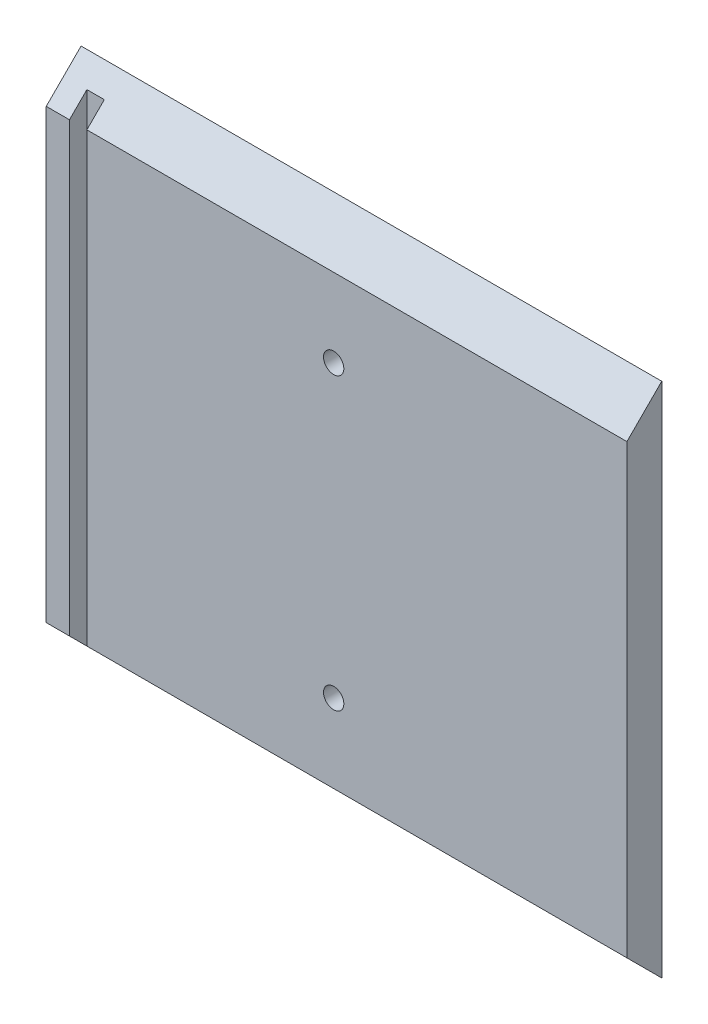
ISO-10303-21;
HEADER;
FILE_DESCRIPTION(('STEP AP214'),'2;1');
FILE_NAME('part.step','',(''),(''),'','','');
FILE_SCHEMA(('AUTOMOTIVE_DESIGN { 1 0 10303 214 1 1 1 1 }'));
ENDSEC;
DATA;
#1=APPLICATION_CONTEXT('core data for automotive mechanical design processes');
#2=APPLICATION_PROTOCOL_DEFINITION('international standard','automotive_design',2000,#1);
#3=PRODUCT_CONTEXT('',#1,'mechanical');
#4=PRODUCT('Part','Part','',(#3));
#5=PRODUCT_RELATED_PRODUCT_CATEGORY('part','',(#4));
#6=PRODUCT_DEFINITION_FORMATION('','',#4);
#7=PRODUCT_DEFINITION_CONTEXT('part definition',#1,'design');
#8=PRODUCT_DEFINITION('design','',#6,#7);
#9=PRODUCT_DEFINITION_SHAPE('','',#8);
#10=(LENGTH_UNIT() NAMED_UNIT(*) SI_UNIT(.MILLI.,.METRE.));
#11=(NAMED_UNIT(*) PLANE_ANGLE_UNIT() SI_UNIT($,.RADIAN.));
#12=(NAMED_UNIT(*) SI_UNIT($,.STERADIAN.) SOLID_ANGLE_UNIT());
#13=UNCERTAINTY_MEASURE_WITH_UNIT(LENGTH_MEASURE(1.E-05),#10,'distance_accuracy_value','');
#14=(GEOMETRIC_REPRESENTATION_CONTEXT(3) GLOBAL_UNCERTAINTY_ASSIGNED_CONTEXT((#13)) GLOBAL_UNIT_ASSIGNED_CONTEXT((#10,
#11,#12)) REPRESENTATION_CONTEXT('',''));
#15=CARTESIAN_POINT('',(0.,0.,0.));
#16=DIRECTION('',(0.,0.,1.));
#17=DIRECTION('',(1.,0.,0.));
#18=AXIS2_PLACEMENT_3D('',#15,#16,#17);
#19=CARTESIAN_POINT('',(0.,0.,6.));
#20=DIRECTION('',(0.,0.,-1.));
#21=DIRECTION('',(-1.,0.,0.));
#22=AXIS2_PLACEMENT_3D('',#19,#20,#21);
#23=PLANE('',#22);
#24=CARTESIAN_POINT('',(-0.499999999999987,-25.,6.));
#25=DIRECTION('',(0.,0.,-1.));
#26=DIRECTION('',(-1.,0.,0.));
#27=AXIS2_PLACEMENT_3D('',#24,#25,#26);
#28=CIRCLE('',#27,1.75);
#29=CARTESIAN_POINT('',(-2.24999999999999,-25.,6.));
#30=VERTEX_POINT('',#29);
#31=EDGE_CURVE('E195',#30,#30,#28,.T.);
#32=ORIENTED_EDGE('',*,*,#31,.T.);
#33=EDGE_LOOP('',(#32));
#34=FACE_BOUND('',#33,.T.);
#35=CARTESIAN_POINT('',(-0.499999999999987,25.,6.));
#36=DIRECTION('',(0.,0.,-1.));
#37=DIRECTION('',(-1.,0.,0.));
#38=AXIS2_PLACEMENT_3D('',#35,#36,#37);
#39=CIRCLE('',#38,1.75);
#40=CARTESIAN_POINT('',(-2.24999999999999,25.,6.));
#41=VERTEX_POINT('',#40);
#42=EDGE_CURVE('E124',#41,#41,#39,.T.);
#43=ORIENTED_EDGE('',*,*,#42,.T.);
#44=EDGE_LOOP('',(#43));
#45=FACE_BOUND('',#44,.T.);
#46=DIRECTION('',(-1.,0.,0.));
#47=VECTOR('',#46,1.);
#48=CARTESIAN_POINT('',(0.,38.5,6.));
#49=LINE('',#48,#47);
#50=CARTESIAN_POINT('',(50.,38.5,6.));
#51=VERTEX_POINT('',#50);
#52=CARTESIAN_POINT('',(-43.,38.5,6.));
#53=VERTEX_POINT('',#52);
#54=EDGE_CURVE('E122',#51,#53,#49,.T.);
#55=ORIENTED_EDGE('',*,*,#54,.T.);
#56=DIRECTION('',(0.,1.,0.));
#57=VECTOR('',#56,1.);
#58=CARTESIAN_POINT('',(-43.,-44.5,6.));
#59=LINE('',#58,#57);
#60=CARTESIAN_POINT('',(-43.,-38.5,6.));
#61=VERTEX_POINT('',#60);
#62=EDGE_CURVE('E108',#61,#53,#59,.T.);
#63=ORIENTED_EDGE('',*,*,#62,.F.);
#64=DIRECTION('',(1.,0.,0.));
#65=VECTOR('',#64,1.);
#66=CARTESIAN_POINT('',(0.,-38.5,6.));
#67=LINE('',#66,#65);
#68=CARTESIAN_POINT('',(50.,-38.5,6.));
#69=VERTEX_POINT('',#68);
#70=EDGE_CURVE('E119',#61,#69,#67,.T.);
#71=ORIENTED_EDGE('',*,*,#70,.T.);
#72=DIRECTION('',(0.,1.,0.));
#73=VECTOR('',#72,1.);
#74=CARTESIAN_POINT('',(50.,-44.5,6.));
#75=LINE('',#74,#73);
#76=EDGE_CURVE('E165',#69,#51,#75,.T.);
#77=ORIENTED_EDGE('',*,*,#76,.T.);
#78=EDGE_LOOP('',(#55,#63,#71,#77));
#79=FACE_BOUND('',#78,.T.);
#80=ADVANCED_FACE('F39',(#34,#45,#79),#23,.F.);
#81=CARTESIAN_POINT('',(50.,-44.5,6.));
#82=DIRECTION('',(-1.,0.,0.));
#83=DIRECTION('',(0.,0.,1.));
#84=AXIS2_PLACEMENT_3D('',#81,#82,#83);
#85=PLANE('',#84);
#86=ORIENTED_EDGE('',*,*,#76,.F.);
#87=DIRECTION('',(0.,0.707106781186547,0.707106781186548));
#88=VECTOR('',#87,1.);
#89=CARTESIAN_POINT('',(50.,-38.5,6.));
#90=LINE('',#89,#88);
#91=CARTESIAN_POINT('',(50.,-44.5,0.));
#92=VERTEX_POINT('',#91);
#93=EDGE_CURVE('E128',#69,#92,#90,.F.);
#94=ORIENTED_EDGE('',*,*,#93,.T.);
#95=DIRECTION('',(0.,1.,0.));
#96=VECTOR('',#95,1.);
#97=CARTESIAN_POINT('',(50.,-44.5,0.));
#98=LINE('',#97,#96);
#99=CARTESIAN_POINT('',(50.,44.5,0.));
#100=VERTEX_POINT('',#99);
#101=EDGE_CURVE('E113',#92,#100,#98,.T.);
#102=ORIENTED_EDGE('',*,*,#101,.T.);
#103=DIRECTION('',(0.,0.707106781186547,-0.707106781186548));
#104=VECTOR('',#103,1.);
#105=CARTESIAN_POINT('',(50.,38.5,6.));
#106=LINE('',#105,#104);
#107=EDGE_CURVE('E136',#100,#51,#106,.F.);
#108=ORIENTED_EDGE('',*,*,#107,.T.);
#109=EDGE_LOOP('',(#86,#94,#102,#108));
#110=FACE_BOUND('',#109,.T.);
#111=ADVANCED_FACE('F184',(#110),#85,.F.);
#112=CARTESIAN_POINT('',(-50.,-44.5,6.));
#113=DIRECTION('',(1.,0.,0.));
#114=DIRECTION('',(0.,0.,-1.));
#115=AXIS2_PLACEMENT_3D('',#112,#113,#114);
#116=PLANE('',#115);
#117=DIRECTION('',(0.,-1.,0.));
#118=VECTOR('',#117,1.);
#119=CARTESIAN_POINT('',(-50.,-44.5,0.));
#120=LINE('',#119,#118);
#121=CARTESIAN_POINT('',(-50.,44.5,0.));
#122=VERTEX_POINT('',#121);
#123=CARTESIAN_POINT('',(-50.,-44.5,0.));
#124=VERTEX_POINT('',#123);
#125=EDGE_CURVE('E176',#122,#124,#120,.T.);
#126=ORIENTED_EDGE('',*,*,#125,.T.);
#127=DIRECTION('',(0.,-0.707106781186547,-0.707106781186548));
#128=VECTOR('',#127,1.);
#129=CARTESIAN_POINT('',(-50.,-38.5,6.));
#130=LINE('',#129,#128);
#131=CARTESIAN_POINT('',(-50.,-38.5,6.));
#132=VERTEX_POINT('',#131);
#133=EDGE_CURVE('E61',#124,#132,#130,.F.);
#134=ORIENTED_EDGE('',*,*,#133,.T.);
#135=DIRECTION('',(0.,-1.,0.));
#136=VECTOR('',#135,1.);
#137=CARTESIAN_POINT('',(-50.,-44.5,6.));
#138=LINE('',#137,#136);
#139=CARTESIAN_POINT('',(-50.,38.5,6.));
#140=VERTEX_POINT('',#139);
#141=EDGE_CURVE('E164',#140,#132,#138,.T.);
#142=ORIENTED_EDGE('',*,*,#141,.F.);
#143=DIRECTION('',(0.,-0.707106781186547,0.707106781186548));
#144=VECTOR('',#143,1.);
#145=CARTESIAN_POINT('',(-50.,38.5,6.));
#146=LINE('',#145,#144);
#147=EDGE_CURVE('E143',#140,#122,#146,.F.);
#148=ORIENTED_EDGE('',*,*,#147,.T.);
#149=EDGE_LOOP('',(#126,#134,#142,#148));
#150=FACE_BOUND('',#149,.T.);
#151=ADVANCED_FACE('F231',(#150),#116,.F.);
#152=CARTESIAN_POINT('',(-46.,-38.5,6.));
#153=VERTEX_POINT('',#152);
#154=EDGE_CURVE('E131',#132,#153,#67,.T.);
#155=ORIENTED_EDGE('',*,*,#154,.T.);
#156=DIRECTION('',(0.,-1.,0.));
#157=VECTOR('',#156,1.);
#158=CARTESIAN_POINT('',(-46.,-44.5,6.));
#159=LINE('',#158,#157);
#160=CARTESIAN_POINT('',(-46.,38.5,6.));
#161=VERTEX_POINT('',#160);
#162=EDGE_CURVE('E123',#161,#153,#159,.T.);
#163=ORIENTED_EDGE('',*,*,#162,.F.);
#164=EDGE_CURVE('E137',#161,#140,#49,.T.);
#165=ORIENTED_EDGE('',*,*,#164,.T.);
#166=ORIENTED_EDGE('',*,*,#141,.T.);
#167=EDGE_LOOP('',(#155,#163,#165,#166));
#168=FACE_BOUND('',#167,.T.);
#169=ADVANCED_FACE('F159',(#168),#23,.F.);
#170=CARTESIAN_POINT('',(0.,0.,0.));
#171=DIRECTION('',(0.,0.,-1.));
#172=DIRECTION('',(-1.,0.,0.));
#173=AXIS2_PLACEMENT_3D('',#170,#171,#172);
#174=PLANE('',#173);
#175=CARTESIAN_POINT('',(-0.499999999999987,-25.,0.));
#176=DIRECTION('',(0.,0.,-1.));
#177=DIRECTION('',(-1.,0.,0.));
#178=AXIS2_PLACEMENT_3D('',#175,#176,#177);
#179=CIRCLE('',#178,1.75);
#180=CARTESIAN_POINT('',(-2.24999999999999,-25.,0.));
#181=VERTEX_POINT('',#180);
#182=EDGE_CURVE('E198',#181,#181,#179,.T.);
#183=ORIENTED_EDGE('',*,*,#182,.F.);
#184=EDGE_LOOP('',(#183));
#185=FACE_BOUND('',#184,.T.);
#186=CARTESIAN_POINT('',(-0.499999999999987,25.,0.));
#187=DIRECTION('',(0.,0.,-1.));
#188=DIRECTION('',(-1.,0.,0.));
#189=AXIS2_PLACEMENT_3D('',#186,#187,#188);
#190=CIRCLE('',#189,1.75);
#191=CARTESIAN_POINT('',(-2.24999999999999,25.,0.));
#192=VERTEX_POINT('',#191);
#193=EDGE_CURVE('E192',#192,#192,#190,.T.);
#194=ORIENTED_EDGE('',*,*,#193,.F.);
#195=EDGE_LOOP('',(#194));
#196=FACE_BOUND('',#195,.T.);
#197=ORIENTED_EDGE('',*,*,#101,.F.);
#198=DIRECTION('',(1.,0.,0.));
#199=VECTOR('',#198,1.);
#200=CARTESIAN_POINT('',(-50.,-44.5,0.));
#201=LINE('',#200,#199);
#202=EDGE_CURVE('E168',#124,#92,#201,.T.);
#203=ORIENTED_EDGE('',*,*,#202,.F.);
#204=ORIENTED_EDGE('',*,*,#125,.F.);
#205=DIRECTION('',(-1.,0.,0.));
#206=VECTOR('',#205,1.);
#207=CARTESIAN_POINT('',(-50.,44.5,0.));
#208=LINE('',#207,#206);
#209=EDGE_CURVE('E174',#100,#122,#208,.T.);
#210=ORIENTED_EDGE('',*,*,#209,.F.);
#211=EDGE_LOOP('',(#197,#203,#204,#210));
#212=FACE_BOUND('',#211,.T.);
#213=ADVANCED_FACE('F181',(#185,#196,#212),#174,.T.);
#214=CARTESIAN_POINT('',(0.,-38.5,6.));
#215=DIRECTION('',(0.,0.707106781186548,-0.707106781186547));
#216=DIRECTION('',(1.,0.,0.));
#217=AXIS2_PLACEMENT_3D('',#214,#215,#216);
#218=PLANE('',#217);
#219=DIRECTION('',(0.,-0.707106781186547,-0.707106781186548));
#220=VECTOR('',#219,1.);
#221=CARTESIAN_POINT('',(-43.,-38.5,6.));
#222=LINE('',#221,#220);
#223=CARTESIAN_POINT('',(-43.,-41.5,3.));
#224=VERTEX_POINT('',#223);
#225=EDGE_CURVE('E105',#224,#61,#222,.F.);
#226=ORIENTED_EDGE('',*,*,#225,.F.);
#227=DIRECTION('',(-1.,0.,0.));
#228=VECTOR('',#227,1.);
#229=CARTESIAN_POINT('',(0.,-41.5,3.));
#230=LINE('',#229,#228);
#231=CARTESIAN_POINT('',(-46.,-41.5,3.));
#232=VERTEX_POINT('',#231);
#233=EDGE_CURVE('E186',#232,#224,#230,.F.);
#234=ORIENTED_EDGE('',*,*,#233,.F.);
#235=DIRECTION('',(0.,0.707106781186547,0.707106781186548));
#236=VECTOR('',#235,1.);
#237=CARTESIAN_POINT('',(-46.,-38.5,6.));
#238=LINE('',#237,#236);
#239=EDGE_CURVE('E114',#153,#232,#238,.F.);
#240=ORIENTED_EDGE('',*,*,#239,.F.);
#241=ORIENTED_EDGE('',*,*,#154,.F.);
#242=ORIENTED_EDGE('',*,*,#133,.F.);
#243=ORIENTED_EDGE('',*,*,#202,.T.);
#244=ORIENTED_EDGE('',*,*,#93,.F.);
#245=ORIENTED_EDGE('',*,*,#70,.F.);
#246=EDGE_LOOP('',(#226,#234,#240,#241,#242,#243,#244,#245));
#247=FACE_BOUND('',#246,.T.);
#248=ADVANCED_FACE('F126',(#247),#218,.F.);
#249=CARTESIAN_POINT('',(0.,38.5,6.));
#250=DIRECTION('',(0.,-0.707106781186548,-0.707106781186547));
#251=DIRECTION('',(-1.,0.,0.));
#252=AXIS2_PLACEMENT_3D('',#249,#250,#251);
#253=PLANE('',#252);
#254=DIRECTION('',(0.,-0.707106781186547,0.707106781186548));
#255=VECTOR('',#254,1.);
#256=CARTESIAN_POINT('',(-43.,38.5,6.));
#257=LINE('',#256,#255);
#258=CARTESIAN_POINT('',(-43.,41.5,3.));
#259=VERTEX_POINT('',#258);
#260=EDGE_CURVE('E11',#53,#259,#257,.F.);
#261=ORIENTED_EDGE('',*,*,#260,.F.);
#262=ORIENTED_EDGE('',*,*,#54,.F.);
#263=ORIENTED_EDGE('',*,*,#107,.F.);
#264=ORIENTED_EDGE('',*,*,#209,.T.);
#265=ORIENTED_EDGE('',*,*,#147,.F.);
#266=ORIENTED_EDGE('',*,*,#164,.F.);
#267=DIRECTION('',(0.,0.707106781186547,-0.707106781186548));
#268=VECTOR('',#267,1.);
#269=CARTESIAN_POINT('',(-46.,38.5,6.));
#270=LINE('',#269,#268);
#271=CARTESIAN_POINT('',(-46.,41.5,3.));
#272=VERTEX_POINT('',#271);
#273=EDGE_CURVE('E47',#272,#161,#270,.F.);
#274=ORIENTED_EDGE('',*,*,#273,.F.);
#275=DIRECTION('',(1.,0.,0.));
#276=VECTOR('',#275,1.);
#277=CARTESIAN_POINT('',(0.,41.5,3.));
#278=LINE('',#277,#276);
#279=EDGE_CURVE('E146',#259,#272,#278,.F.);
#280=ORIENTED_EDGE('',*,*,#279,.F.);
#281=EDGE_LOOP('',(#261,#262,#263,#264,#265,#266,#274,#280));
#282=FACE_BOUND('',#281,.T.);
#283=ADVANCED_FACE('F41',(#282),#253,.F.);
#284=CARTESIAN_POINT('',(-43.,-44.5,3.));
#285=DIRECTION('',(1.,0.,0.));
#286=DIRECTION('',(0.,1.,0.));
#287=AXIS2_PLACEMENT_3D('',#284,#285,#286);
#288=PLANE('',#287);
#289=ORIENTED_EDGE('',*,*,#225,.T.);
#290=ORIENTED_EDGE('',*,*,#62,.T.);
#291=ORIENTED_EDGE('',*,*,#260,.T.);
#292=DIRECTION('',(0.,1.,0.));
#293=VECTOR('',#292,1.);
#294=CARTESIAN_POINT('',(-43.,-44.5,3.));
#295=LINE('',#294,#293);
#296=EDGE_CURVE('E54',#224,#259,#295,.T.);
#297=ORIENTED_EDGE('',*,*,#296,.F.);
#298=EDGE_LOOP('',(#289,#290,#291,#297));
#299=FACE_BOUND('',#298,.T.);
#300=ADVANCED_FACE('F107',(#299),#288,.F.);
#301=CARTESIAN_POINT('',(-46.,-44.5,3.));
#302=DIRECTION('',(-1.,0.,0.));
#303=DIRECTION('',(0.,0.,1.));
#304=AXIS2_PLACEMENT_3D('',#301,#302,#303);
#305=PLANE('',#304);
#306=ORIENTED_EDGE('',*,*,#239,.T.);
#307=DIRECTION('',(0.,-1.,0.));
#308=VECTOR('',#307,1.);
#309=CARTESIAN_POINT('',(-46.,-44.5,3.));
#310=LINE('',#309,#308);
#311=EDGE_CURVE('E154',#272,#232,#310,.T.);
#312=ORIENTED_EDGE('',*,*,#311,.F.);
#313=ORIENTED_EDGE('',*,*,#273,.T.);
#314=ORIENTED_EDGE('',*,*,#162,.T.);
#315=EDGE_LOOP('',(#306,#312,#313,#314));
#316=FACE_BOUND('',#315,.T.);
#317=ADVANCED_FACE('F151',(#316),#305,.F.);
#318=CARTESIAN_POINT('',(0.,0.,3.));
#319=DIRECTION('',(0.,0.,-1.));
#320=DIRECTION('',(-1.,0.,0.));
#321=AXIS2_PLACEMENT_3D('',#318,#319,#320);
#322=PLANE('',#321);
#323=ORIENTED_EDGE('',*,*,#233,.T.);
#324=ORIENTED_EDGE('',*,*,#296,.T.);
#325=ORIENTED_EDGE('',*,*,#279,.T.);
#326=ORIENTED_EDGE('',*,*,#311,.T.);
#327=EDGE_LOOP('',(#323,#324,#325,#326));
#328=FACE_BOUND('',#327,.T.);
#329=ADVANCED_FACE('F185',(#328),#322,.F.);
#330=CARTESIAN_POINT('',(-0.499999999999987,25.,6.));
#331=DIRECTION('',(0.,0.,-1.));
#332=DIRECTION('',(-1.,0.,0.));
#333=AXIS2_PLACEMENT_3D('',#330,#331,#332);
#334=CYLINDRICAL_SURFACE('',#333,1.75);
#335=ORIENTED_EDGE('',*,*,#42,.F.);
#336=EDGE_LOOP('',(#335));
#337=FACE_BOUND('',#336,.T.);
#338=ORIENTED_EDGE('',*,*,#193,.T.);
#339=EDGE_LOOP('',(#338));
#340=FACE_BOUND('',#339,.T.);
#341=ADVANCED_FACE('F209',(#337,#340),#334,.F.);
#342=CARTESIAN_POINT('',(-0.499999999999987,-25.,6.));
#343=DIRECTION('',(0.,0.,-1.));
#344=DIRECTION('',(-1.,0.,0.));
#345=AXIS2_PLACEMENT_3D('',#342,#343,#344);
#346=CYLINDRICAL_SURFACE('',#345,1.75);
#347=ORIENTED_EDGE('',*,*,#31,.F.);
#348=EDGE_LOOP('',(#347));
#349=FACE_BOUND('',#348,.T.);
#350=ORIENTED_EDGE('',*,*,#182,.T.);
#351=EDGE_LOOP('',(#350));
#352=FACE_BOUND('',#351,.T.);
#353=ADVANCED_FACE('F206',(#349,#352),#346,.F.);
#354=CLOSED_SHELL('',(#80,#111,#151,#169,#213,#248,#283,#300,#317,#329,#341,#353));
#355=MANIFOLD_SOLID_BREP('B2',#354);
#356=ADVANCED_BREP_SHAPE_REPRESENTATION('',(#18,#355),#14);
#357=SHAPE_DEFINITION_REPRESENTATION(#9,#356);
ENDSEC;
END-ISO-10303-21;
